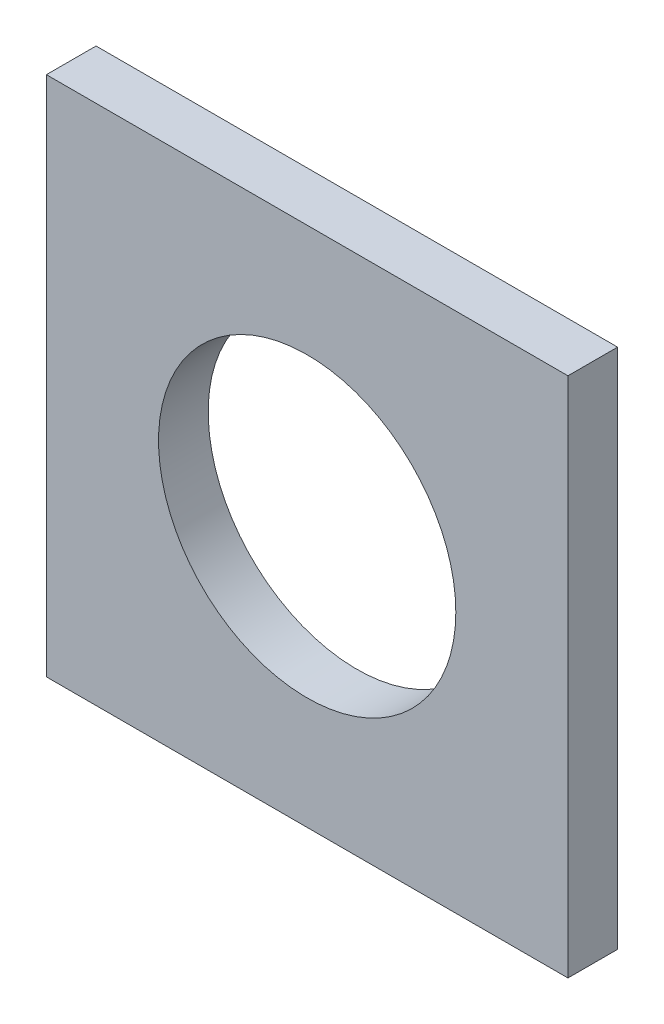
ISO-10303-21;
HEADER;
FILE_DESCRIPTION(('STEP AP214'),'2;1');
FILE_NAME('part.step','',(''),(''),'','','');
FILE_SCHEMA(('AUTOMOTIVE_DESIGN { 1 0 10303 214 1 1 1 1 }'));
ENDSEC;
DATA;
#1=APPLICATION_CONTEXT('core data for automotive mechanical design processes');
#2=APPLICATION_PROTOCOL_DEFINITION('international standard','automotive_design',2000,#1);
#3=PRODUCT_CONTEXT('',#1,'mechanical');
#4=PRODUCT('Part','Part','',(#3));
#5=PRODUCT_RELATED_PRODUCT_CATEGORY('part','',(#4));
#6=PRODUCT_DEFINITION_FORMATION('','',#4);
#7=PRODUCT_DEFINITION_CONTEXT('part definition',#1,'design');
#8=PRODUCT_DEFINITION('design','',#6,#7);
#9=PRODUCT_DEFINITION_SHAPE('','',#8);
#10=(LENGTH_UNIT() NAMED_UNIT(*) SI_UNIT(.MILLI.,.METRE.));
#11=(NAMED_UNIT(*) PLANE_ANGLE_UNIT() SI_UNIT($,.RADIAN.));
#12=(NAMED_UNIT(*) SI_UNIT($,.STERADIAN.) SOLID_ANGLE_UNIT());
#13=UNCERTAINTY_MEASURE_WITH_UNIT(LENGTH_MEASURE(1.E-05),#10,'distance_accuracy_value','');
#14=(GEOMETRIC_REPRESENTATION_CONTEXT(3) GLOBAL_UNCERTAINTY_ASSIGNED_CONTEXT((#13)) GLOBAL_UNIT_ASSIGNED_CONTEXT((#10,
#11,#12)) REPRESENTATION_CONTEXT('',''));
#15=CARTESIAN_POINT('',(0.,0.,0.));
#16=DIRECTION('',(0.,0.,1.));
#17=DIRECTION('',(1.,0.,0.));
#18=AXIS2_PLACEMENT_3D('',#15,#16,#17);
#19=CARTESIAN_POINT('',(0.,0.,4.76));
#20=DIRECTION('',(0.,0.,1.));
#21=DIRECTION('',(1.,0.,0.));
#22=AXIS2_PLACEMENT_3D('',#19,#20,#21);
#23=PLANE('',#22);
#24=DIRECTION('',(1.,0.,0.));
#25=VECTOR('',#24,1.);
#26=CARTESIAN_POINT('',(-25.,-25.,4.76));
#27=LINE('',#26,#25);
#28=CARTESIAN_POINT('',(-25.,-25.,4.76));
#29=VERTEX_POINT('',#28);
#30=CARTESIAN_POINT('',(25.,-25.,4.76));
#31=VERTEX_POINT('',#30);
#32=EDGE_CURVE('E96',#29,#31,#27,.T.);
#33=ORIENTED_EDGE('',*,*,#32,.T.);
#34=DIRECTION('',(0.,1.,0.));
#35=VECTOR('',#34,1.);
#36=CARTESIAN_POINT('',(25.,-25.,4.76));
#37=LINE('',#36,#35);
#38=CARTESIAN_POINT('',(25.,25.,4.76));
#39=VERTEX_POINT('',#38);
#40=EDGE_CURVE('E91',#31,#39,#37,.T.);
#41=ORIENTED_EDGE('',*,*,#40,.T.);
#42=DIRECTION('',(-1.,0.,0.));
#43=VECTOR('',#42,1.);
#44=CARTESIAN_POINT('',(-25.,25.,4.76));
#45=LINE('',#44,#43);
#46=CARTESIAN_POINT('',(-25.,25.,4.76));
#47=VERTEX_POINT('',#46);
#48=EDGE_CURVE('E94',#39,#47,#45,.T.);
#49=ORIENTED_EDGE('',*,*,#48,.T.);
#50=DIRECTION('',(0.,-1.,0.));
#51=VECTOR('',#50,1.);
#52=CARTESIAN_POINT('',(-25.,-25.,4.76));
#53=LINE('',#52,#51);
#54=EDGE_CURVE('E61',#47,#29,#53,.T.);
#55=ORIENTED_EDGE('',*,*,#54,.T.);
#56=EDGE_LOOP('',(#33,#41,#49,#55));
#57=FACE_BOUND('',#56,.T.);
#58=CARTESIAN_POINT('',(0.,0.,4.76));
#59=DIRECTION('',(0.,0.,1.));
#60=DIRECTION('',(1.,0.,0.));
#61=AXIS2_PLACEMENT_3D('',#58,#59,#60);
#62=CIRCLE('',#61,14.25);
#63=CARTESIAN_POINT('',(14.25,0.,4.76));
#64=VERTEX_POINT('',#63);
#65=EDGE_CURVE('E116',#64,#64,#62,.T.);
#66=ORIENTED_EDGE('',*,*,#65,.F.);
#67=EDGE_LOOP('',(#66));
#68=FACE_BOUND('',#67,.T.);
#69=ADVANCED_FACE('F43',(#57,#68),#23,.T.);
#70=CARTESIAN_POINT('',(0.,0.,0.));
#71=DIRECTION('',(0.,0.,1.));
#72=DIRECTION('',(1.,0.,0.));
#73=AXIS2_PLACEMENT_3D('',#70,#71,#72);
#74=PLANE('',#73);
#75=DIRECTION('',(1.,0.,0.));
#76=VECTOR('',#75,1.);
#77=CARTESIAN_POINT('',(-25.,-25.,0.));
#78=LINE('',#77,#76);
#79=CARTESIAN_POINT('',(-25.,-25.,0.));
#80=VERTEX_POINT('',#79);
#81=CARTESIAN_POINT('',(25.,-25.,0.));
#82=VERTEX_POINT('',#81);
#83=EDGE_CURVE('E112',#80,#82,#78,.T.);
#84=ORIENTED_EDGE('',*,*,#83,.F.);
#85=DIRECTION('',(0.,-1.,0.));
#86=VECTOR('',#85,1.);
#87=CARTESIAN_POINT('',(-25.,-25.,0.));
#88=LINE('',#87,#86);
#89=CARTESIAN_POINT('',(-25.,25.,0.));
#90=VERTEX_POINT('',#89);
#91=EDGE_CURVE('E84',#90,#80,#88,.T.);
#92=ORIENTED_EDGE('',*,*,#91,.F.);
#93=DIRECTION('',(-1.,0.,0.));
#94=VECTOR('',#93,1.);
#95=CARTESIAN_POINT('',(-25.,25.,0.));
#96=LINE('',#95,#94);
#97=CARTESIAN_POINT('',(25.,25.,0.));
#98=VERTEX_POINT('',#97);
#99=EDGE_CURVE('E78',#98,#90,#96,.T.);
#100=ORIENTED_EDGE('',*,*,#99,.F.);
#101=DIRECTION('',(0.,1.,0.));
#102=VECTOR('',#101,1.);
#103=CARTESIAN_POINT('',(25.,-25.,0.));
#104=LINE('',#103,#102);
#105=EDGE_CURVE('E101',#82,#98,#104,.T.);
#106=ORIENTED_EDGE('',*,*,#105,.F.);
#107=EDGE_LOOP('',(#84,#92,#100,#106));
#108=FACE_BOUND('',#107,.T.);
#109=CARTESIAN_POINT('',(0.,0.,0.));
#110=DIRECTION('',(0.,0.,1.));
#111=DIRECTION('',(1.,0.,0.));
#112=AXIS2_PLACEMENT_3D('',#109,#110,#111);
#113=CIRCLE('',#112,14.25);
#114=CARTESIAN_POINT('',(14.25,0.,0.));
#115=VERTEX_POINT('',#114);
#116=EDGE_CURVE('E134',#115,#115,#113,.T.);
#117=ORIENTED_EDGE('',*,*,#116,.T.);
#118=EDGE_LOOP('',(#117));
#119=FACE_BOUND('',#118,.T.);
#120=ADVANCED_FACE('F129',(#108,#119),#74,.F.);
#121=CARTESIAN_POINT('',(-25.,-25.,4.76));
#122=DIRECTION('',(0.,1.,0.));
#123=DIRECTION('',(-1.,0.,0.));
#124=AXIS2_PLACEMENT_3D('',#121,#122,#123);
#125=PLANE('',#124);
#126=ORIENTED_EDGE('',*,*,#83,.T.);
#127=DIRECTION('',(0.,0.,-1.));
#128=VECTOR('',#127,1.);
#129=CARTESIAN_POINT('',(25.,-25.,4.76));
#130=LINE('',#129,#128);
#131=EDGE_CURVE('E11',#31,#82,#130,.T.);
#132=ORIENTED_EDGE('',*,*,#131,.F.);
#133=ORIENTED_EDGE('',*,*,#32,.F.);
#134=DIRECTION('',(0.,0.,-1.));
#135=VECTOR('',#134,1.);
#136=CARTESIAN_POINT('',(-25.,-25.,4.76));
#137=LINE('',#136,#135);
#138=EDGE_CURVE('E108',#29,#80,#137,.T.);
#139=ORIENTED_EDGE('',*,*,#138,.T.);
#140=EDGE_LOOP('',(#126,#132,#133,#139));
#141=FACE_BOUND('',#140,.T.);
#142=ADVANCED_FACE('F45',(#141),#125,.F.);
#143=CARTESIAN_POINT('',(25.,-25.,4.76));
#144=DIRECTION('',(-1.,0.,0.));
#145=DIRECTION('',(0.,0.,1.));
#146=AXIS2_PLACEMENT_3D('',#143,#144,#145);
#147=PLANE('',#146);
#148=ORIENTED_EDGE('',*,*,#105,.T.);
#149=DIRECTION('',(0.,0.,-1.));
#150=VECTOR('',#149,1.);
#151=CARTESIAN_POINT('',(25.,25.,4.76));
#152=LINE('',#151,#150);
#153=EDGE_CURVE('E53',#39,#98,#152,.T.);
#154=ORIENTED_EDGE('',*,*,#153,.F.);
#155=ORIENTED_EDGE('',*,*,#40,.F.);
#156=ORIENTED_EDGE('',*,*,#131,.T.);
#157=EDGE_LOOP('',(#148,#154,#155,#156));
#158=FACE_BOUND('',#157,.T.);
#159=ADVANCED_FACE('F100',(#158),#147,.F.);
#160=CARTESIAN_POINT('',(-25.,25.,4.76));
#161=DIRECTION('',(0.,-1.,0.));
#162=DIRECTION('',(0.,0.,-1.));
#163=AXIS2_PLACEMENT_3D('',#160,#161,#162);
#164=PLANE('',#163);
#165=ORIENTED_EDGE('',*,*,#99,.T.);
#166=DIRECTION('',(0.,0.,-1.));
#167=VECTOR('',#166,1.);
#168=CARTESIAN_POINT('',(-25.,25.,4.76));
#169=LINE('',#168,#167);
#170=EDGE_CURVE('E103',#47,#90,#169,.T.);
#171=ORIENTED_EDGE('',*,*,#170,.F.);
#172=ORIENTED_EDGE('',*,*,#48,.F.);
#173=ORIENTED_EDGE('',*,*,#153,.T.);
#174=EDGE_LOOP('',(#165,#171,#172,#173));
#175=FACE_BOUND('',#174,.T.);
#176=ADVANCED_FACE('F104',(#175),#164,.F.);
#177=CARTESIAN_POINT('',(-25.,-25.,4.76));
#178=DIRECTION('',(1.,0.,0.));
#179=DIRECTION('',(0.,0.,-1.));
#180=AXIS2_PLACEMENT_3D('',#177,#178,#179);
#181=PLANE('',#180);
#182=ORIENTED_EDGE('',*,*,#91,.T.);
#183=ORIENTED_EDGE('',*,*,#138,.F.);
#184=ORIENTED_EDGE('',*,*,#54,.F.);
#185=ORIENTED_EDGE('',*,*,#170,.T.);
#186=EDGE_LOOP('',(#182,#183,#184,#185));
#187=FACE_BOUND('',#186,.T.);
#188=ADVANCED_FACE('F126',(#187),#181,.F.);
#189=CARTESIAN_POINT('',(0.,0.,4.76));
#190=DIRECTION('',(0.,0.,-1.));
#191=DIRECTION('',(-1.,0.,0.));
#192=AXIS2_PLACEMENT_3D('',#189,#190,#191);
#193=CYLINDRICAL_SURFACE('',#192,14.25);
#194=ORIENTED_EDGE('',*,*,#65,.T.);
#195=EDGE_LOOP('',(#194));
#196=FACE_BOUND('',#195,.T.);
#197=ORIENTED_EDGE('',*,*,#116,.F.);
#198=EDGE_LOOP('',(#197));
#199=FACE_BOUND('',#198,.T.);
#200=ADVANCED_FACE('F142',(#196,#199),#193,.F.);
#201=CLOSED_SHELL('',(#69,#120,#142,#159,#176,#188,#200));
#202=MANIFOLD_SOLID_BREP('B2',#201);
#203=ADVANCED_BREP_SHAPE_REPRESENTATION('',(#18,#202),#14);
#204=SHAPE_DEFINITION_REPRESENTATION(#9,#203);
ENDSEC;
END-ISO-10303-21;
